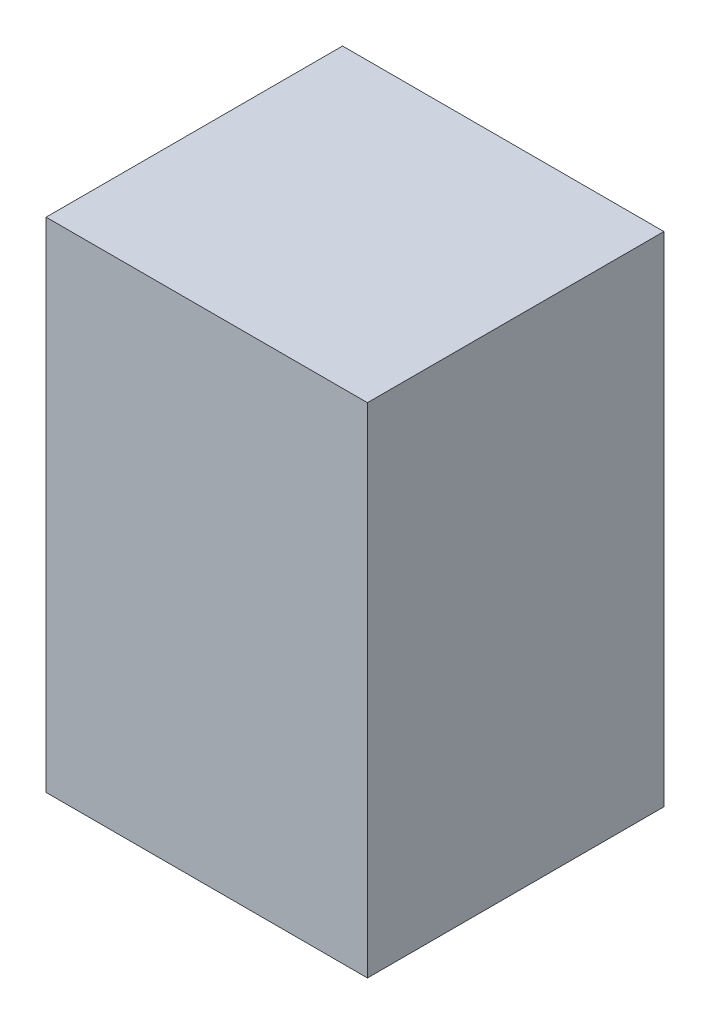
ISO-10303-21;
HEADER;
FILE_DESCRIPTION(('STEP AP214'),'2;1');
FILE_NAME('part.step','',(''),(''),'','','');
FILE_SCHEMA(('AUTOMOTIVE_DESIGN { 1 0 10303 214 1 1 1 1 }'));
ENDSEC;
DATA;
#1=APPLICATION_CONTEXT('core data for automotive mechanical design processes');
#2=APPLICATION_PROTOCOL_DEFINITION('international standard','automotive_design',2000,#1);
#3=PRODUCT_CONTEXT('',#1,'mechanical');
#4=PRODUCT('Part','Part','',(#3));
#5=PRODUCT_RELATED_PRODUCT_CATEGORY('part','',(#4));
#6=PRODUCT_DEFINITION_FORMATION('','',#4);
#7=PRODUCT_DEFINITION_CONTEXT('part definition',#1,'design');
#8=PRODUCT_DEFINITION('design','',#6,#7);
#9=PRODUCT_DEFINITION_SHAPE('','',#8);
#10=(LENGTH_UNIT() NAMED_UNIT(*) SI_UNIT(.MILLI.,.METRE.));
#11=(NAMED_UNIT(*) PLANE_ANGLE_UNIT() SI_UNIT($,.RADIAN.));
#12=(NAMED_UNIT(*) SI_UNIT($,.STERADIAN.) SOLID_ANGLE_UNIT());
#13=UNCERTAINTY_MEASURE_WITH_UNIT(LENGTH_MEASURE(1.E-05),#10,'distance_accuracy_value','');
#14=(GEOMETRIC_REPRESENTATION_CONTEXT(3) GLOBAL_UNCERTAINTY_ASSIGNED_CONTEXT((#13)) GLOBAL_UNIT_ASSIGNED_CONTEXT((#10,
#11,#12)) REPRESENTATION_CONTEXT('',''));
#15=CARTESIAN_POINT('',(0.,0.,0.));
#16=DIRECTION('',(0.,0.,1.));
#17=DIRECTION('',(1.,0.,0.));
#18=AXIS2_PLACEMENT_3D('',#15,#16,#17);
#19=CARTESIAN_POINT('',(0.,2540.,0.));
#20=DIRECTION('',(1.,0.,0.));
#21=DIRECTION('',(0.,0.,-1.));
#22=AXIS2_PLACEMENT_3D('',#19,#20,#21);
#23=PLANE('',#22);
#24=DIRECTION('',(0.,0.,1.));
#25=VECTOR('',#24,1.);
#26=CARTESIAN_POINT('',(0.,0.,0.));
#27=LINE('',#26,#25);
#28=CARTESIAN_POINT('',(0.,0.,-1511.3));
#29=VERTEX_POINT('',#28);
#30=CARTESIAN_POINT('',(0.,0.,0.));
#31=VERTEX_POINT('',#30);
#32=EDGE_CURVE('E100',#29,#31,#27,.T.);
#33=ORIENTED_EDGE('',*,*,#32,.T.);
#34=DIRECTION('',(0.,-1.,0.));
#35=VECTOR('',#34,1.);
#36=CARTESIAN_POINT('',(0.,2540.,0.));
#37=LINE('',#36,#35);
#38=CARTESIAN_POINT('',(0.,2540.,0.));
#39=VERTEX_POINT('',#38);
#40=EDGE_CURVE('E11',#39,#31,#37,.T.);
#41=ORIENTED_EDGE('',*,*,#40,.F.);
#42=DIRECTION('',(0.,0.,1.));
#43=VECTOR('',#42,1.);
#44=CARTESIAN_POINT('',(0.,2540.,0.));
#45=LINE('',#44,#43);
#46=CARTESIAN_POINT('',(0.,2540.,-1511.3));
#47=VERTEX_POINT('',#46);
#48=EDGE_CURVE('E88',#47,#39,#45,.T.);
#49=ORIENTED_EDGE('',*,*,#48,.F.);
#50=DIRECTION('',(0.,-1.,0.));
#51=VECTOR('',#50,1.);
#52=CARTESIAN_POINT('',(0.,2540.,-1511.3));
#53=LINE('',#52,#51);
#54=EDGE_CURVE('E96',#47,#29,#53,.T.);
#55=ORIENTED_EDGE('',*,*,#54,.T.);
#56=EDGE_LOOP('',(#33,#41,#49,#55));
#57=FACE_BOUND('',#56,.T.);
#58=ADVANCED_FACE('F37',(#57),#23,.F.);
#59=CARTESIAN_POINT('',(0.,2540.,0.));
#60=DIRECTION('',(0.,0.,-1.));
#61=DIRECTION('',(-1.,0.,0.));
#62=AXIS2_PLACEMENT_3D('',#59,#60,#61);
#63=PLANE('',#62);
#64=DIRECTION('',(1.,0.,0.));
#65=VECTOR('',#64,1.);
#66=CARTESIAN_POINT('',(0.,0.,0.));
#67=LINE('',#66,#65);
#68=CARTESIAN_POINT('',(1638.3,0.,0.));
#69=VERTEX_POINT('',#68);
#70=EDGE_CURVE('E92',#31,#69,#67,.T.);
#71=ORIENTED_EDGE('',*,*,#70,.T.);
#72=DIRECTION('',(0.,-1.,0.));
#73=VECTOR('',#72,1.);
#74=CARTESIAN_POINT('',(1638.3,2540.,0.));
#75=LINE('',#74,#73);
#76=CARTESIAN_POINT('',(1638.3,2540.,0.));
#77=VERTEX_POINT('',#76);
#78=EDGE_CURVE('E45',#77,#69,#75,.T.);
#79=ORIENTED_EDGE('',*,*,#78,.F.);
#80=DIRECTION('',(1.,0.,0.));
#81=VECTOR('',#80,1.);
#82=CARTESIAN_POINT('',(0.,2540.,0.));
#83=LINE('',#82,#81);
#84=EDGE_CURVE('E83',#39,#77,#83,.T.);
#85=ORIENTED_EDGE('',*,*,#84,.F.);
#86=ORIENTED_EDGE('',*,*,#40,.T.);
#87=EDGE_LOOP('',(#71,#79,#85,#86));
#88=FACE_BOUND('',#87,.T.);
#89=ADVANCED_FACE('F91',(#88),#63,.F.);
#90=CARTESIAN_POINT('',(1638.3,2540.,0.));
#91=DIRECTION('',(-1.,0.,0.));
#92=DIRECTION('',(0.,0.,1.));
#93=AXIS2_PLACEMENT_3D('',#90,#91,#92);
#94=PLANE('',#93);
#95=DIRECTION('',(0.,0.,-1.));
#96=VECTOR('',#95,1.);
#97=CARTESIAN_POINT('',(1638.3,0.,0.));
#98=LINE('',#97,#96);
#99=CARTESIAN_POINT('',(1638.3,0.,-1511.3));
#100=VERTEX_POINT('',#99);
#101=EDGE_CURVE('E70',#69,#100,#98,.T.);
#102=ORIENTED_EDGE('',*,*,#101,.T.);
#103=DIRECTION('',(0.,-1.,0.));
#104=VECTOR('',#103,1.);
#105=CARTESIAN_POINT('',(1638.3,2540.,-1511.3));
#106=LINE('',#105,#104);
#107=CARTESIAN_POINT('',(1638.3,2540.,-1511.3));
#108=VERTEX_POINT('',#107);
#109=EDGE_CURVE('E93',#108,#100,#106,.T.);
#110=ORIENTED_EDGE('',*,*,#109,.F.);
#111=DIRECTION('',(0.,0.,-1.));
#112=VECTOR('',#111,1.);
#113=CARTESIAN_POINT('',(1638.3,2540.,0.));
#114=LINE('',#113,#112);
#115=EDGE_CURVE('E86',#77,#108,#114,.T.);
#116=ORIENTED_EDGE('',*,*,#115,.F.);
#117=ORIENTED_EDGE('',*,*,#78,.T.);
#118=EDGE_LOOP('',(#102,#110,#116,#117));
#119=FACE_BOUND('',#118,.T.);
#120=ADVANCED_FACE('F94',(#119),#94,.F.);
#121=CARTESIAN_POINT('',(0.,2540.,-1511.3));
#122=DIRECTION('',(0.,0.,1.));
#123=DIRECTION('',(1.,0.,0.));
#124=AXIS2_PLACEMENT_3D('',#121,#122,#123);
#125=PLANE('',#124);
#126=DIRECTION('',(-1.,0.,0.));
#127=VECTOR('',#126,1.);
#128=CARTESIAN_POINT('',(0.,0.,-1511.3));
#129=LINE('',#128,#127);
#130=EDGE_CURVE('E76',#100,#29,#129,.T.);
#131=ORIENTED_EDGE('',*,*,#130,.T.);
#132=ORIENTED_EDGE('',*,*,#54,.F.);
#133=DIRECTION('',(-1.,0.,0.));
#134=VECTOR('',#133,1.);
#135=CARTESIAN_POINT('',(0.,2540.,-1511.3));
#136=LINE('',#135,#134);
#137=EDGE_CURVE('E53',#108,#47,#136,.T.);
#138=ORIENTED_EDGE('',*,*,#137,.F.);
#139=ORIENTED_EDGE('',*,*,#109,.T.);
#140=EDGE_LOOP('',(#131,#132,#138,#139));
#141=FACE_BOUND('',#140,.T.);
#142=ADVANCED_FACE('F107',(#141),#125,.F.);
#143=CARTESIAN_POINT('',(0.,2540.,0.));
#144=DIRECTION('',(0.,-1.,0.));
#145=DIRECTION('',(0.,0.,-1.));
#146=AXIS2_PLACEMENT_3D('',#143,#144,#145);
#147=PLANE('',#146);
#148=ORIENTED_EDGE('',*,*,#48,.T.);
#149=ORIENTED_EDGE('',*,*,#84,.T.);
#150=ORIENTED_EDGE('',*,*,#115,.T.);
#151=ORIENTED_EDGE('',*,*,#137,.T.);
#152=EDGE_LOOP('',(#148,#149,#150,#151));
#153=FACE_BOUND('',#152,.T.);
#154=ADVANCED_FACE('F84',(#153),#147,.F.);
#155=CARTESIAN_POINT('',(0.,0.,0.));
#156=DIRECTION('',(0.,-1.,0.));
#157=DIRECTION('',(0.,0.,-1.));
#158=AXIS2_PLACEMENT_3D('',#155,#156,#157);
#159=PLANE('',#158);
#160=ORIENTED_EDGE('',*,*,#32,.F.);
#161=ORIENTED_EDGE('',*,*,#130,.F.);
#162=ORIENTED_EDGE('',*,*,#101,.F.);
#163=ORIENTED_EDGE('',*,*,#70,.F.);
#164=EDGE_LOOP('',(#160,#161,#162,#163));
#165=FACE_BOUND('',#164,.T.);
#166=ADVANCED_FACE('F110',(#165),#159,.T.);
#167=CLOSED_SHELL('',(#58,#89,#120,#142,#154,#166));
#168=MANIFOLD_SOLID_BREP('B2',#167);
#169=ADVANCED_BREP_SHAPE_REPRESENTATION('',(#18,#168),#14);
#170=SHAPE_DEFINITION_REPRESENTATION(#9,#169);
ENDSEC;
END-ISO-10303-21;
